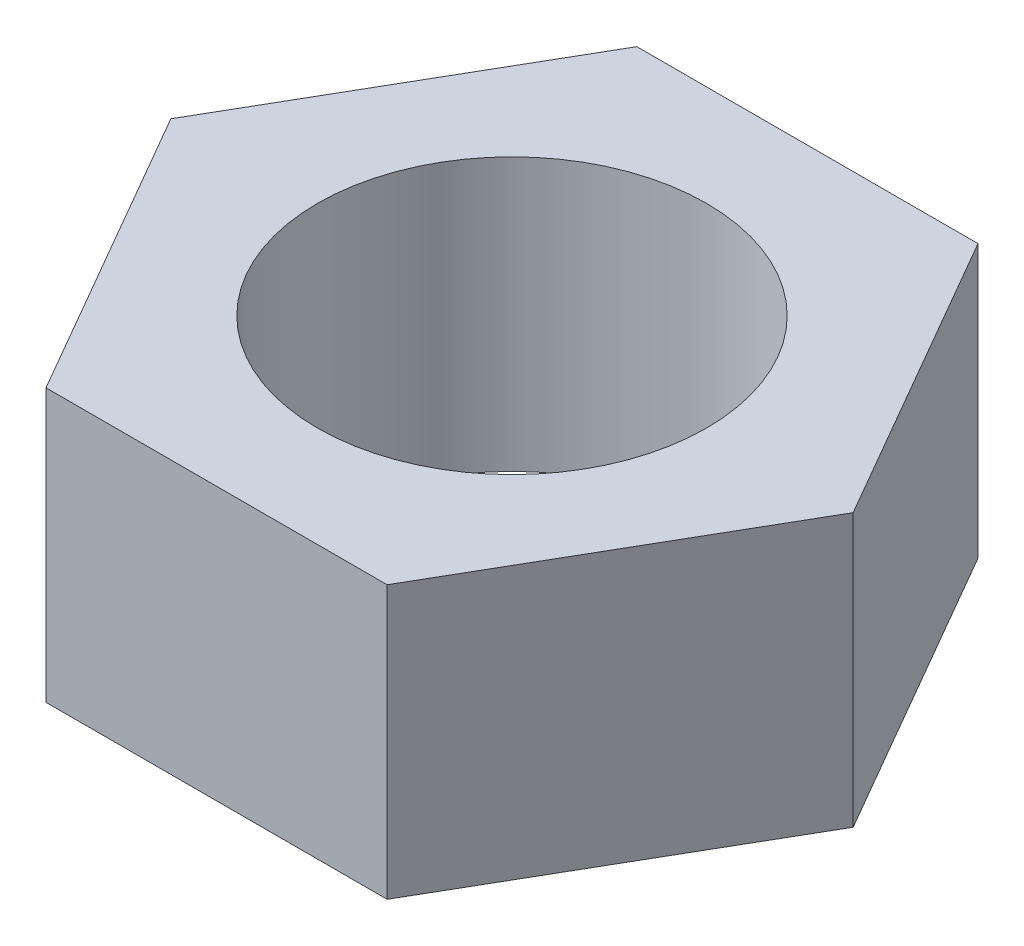
ISO-10303-21;
HEADER;
FILE_DESCRIPTION(('STEP AP214'),'2;1');
FILE_NAME('part.step','',(''),(''),'','','');
FILE_SCHEMA(('AUTOMOTIVE_DESIGN { 1 0 10303 214 1 1 1 1 }'));
ENDSEC;
DATA;
#1=APPLICATION_CONTEXT('core data for automotive mechanical design processes');
#2=APPLICATION_PROTOCOL_DEFINITION('international standard','automotive_design',2000,#1);
#3=PRODUCT_CONTEXT('',#1,'mechanical');
#4=PRODUCT('Part','Part','',(#3));
#5=PRODUCT_RELATED_PRODUCT_CATEGORY('part','',(#4));
#6=PRODUCT_DEFINITION_FORMATION('','',#4);
#7=PRODUCT_DEFINITION_CONTEXT('part definition',#1,'design');
#8=PRODUCT_DEFINITION('design','',#6,#7);
#9=PRODUCT_DEFINITION_SHAPE('','',#8);
#10=(LENGTH_UNIT() NAMED_UNIT(*) SI_UNIT(.MILLI.,.METRE.));
#11=(NAMED_UNIT(*) PLANE_ANGLE_UNIT() SI_UNIT($,.RADIAN.));
#12=(NAMED_UNIT(*) SI_UNIT($,.STERADIAN.) SOLID_ANGLE_UNIT());
#13=UNCERTAINTY_MEASURE_WITH_UNIT(LENGTH_MEASURE(1.E-05),#10,'distance_accuracy_value','');
#14=(GEOMETRIC_REPRESENTATION_CONTEXT(3) GLOBAL_UNCERTAINTY_ASSIGNED_CONTEXT((#13)) GLOBAL_UNIT_ASSIGNED_CONTEXT((#10,
#11,#12)) REPRESENTATION_CONTEXT('',''));
#15=CARTESIAN_POINT('',(0.,0.,0.));
#16=DIRECTION('',(0.,0.,1.));
#17=DIRECTION('',(1.,0.,0.));
#18=AXIS2_PLACEMENT_3D('',#15,#16,#17);
#19=CARTESIAN_POINT('',(0.,7.7,0.));
#20=DIRECTION('',(0.,1.,0.));
#21=DIRECTION('',(0.,0.,1.));
#22=AXIS2_PLACEMENT_3D('',#19,#20,#21);
#23=PLANE('',#22);
#24=DIRECTION('',(1.,0.,0.));
#25=VECTOR('',#24,1.);
#26=CARTESIAN_POINT('',(-4.82087474773337,7.7,8.35));
#27=LINE('',#26,#25);
#28=CARTESIAN_POINT('',(-4.82087474773337,7.7,8.35));
#29=VERTEX_POINT('',#28);
#30=CARTESIAN_POINT('',(4.82087474773337,7.7,8.35));
#31=VERTEX_POINT('',#30);
#32=EDGE_CURVE('E137',#29,#31,#27,.T.);
#33=ORIENTED_EDGE('',*,*,#32,.T.);
#34=DIRECTION('',(0.5,0.,-0.866025403784439));
#35=VECTOR('',#34,1.);
#36=CARTESIAN_POINT('',(4.82087474773337,7.7,8.35));
#37=LINE('',#36,#35);
#38=CARTESIAN_POINT('',(9.64174949546675,7.7,0.));
#39=VERTEX_POINT('',#38);
#40=EDGE_CURVE('E95',#31,#39,#37,.T.);
#41=ORIENTED_EDGE('',*,*,#40,.T.);
#42=DIRECTION('',(-0.5,0.,-0.866025403784439));
#43=VECTOR('',#42,1.);
#44=CARTESIAN_POINT('',(9.64174949546675,7.7,0.));
#45=LINE('',#44,#43);
#46=CARTESIAN_POINT('',(4.82087474773337,7.7,-8.35));
#47=VERTEX_POINT('',#46);
#48=EDGE_CURVE('E108',#39,#47,#45,.T.);
#49=ORIENTED_EDGE('',*,*,#48,.T.);
#50=DIRECTION('',(-1.,0.,0.));
#51=VECTOR('',#50,1.);
#52=CARTESIAN_POINT('',(4.82087474773337,7.7,-8.35));
#53=LINE('',#52,#51);
#54=CARTESIAN_POINT('',(-4.82087474773337,7.7,-8.35));
#55=VERTEX_POINT('',#54);
#56=EDGE_CURVE('E102',#47,#55,#53,.T.);
#57=ORIENTED_EDGE('',*,*,#56,.T.);
#58=DIRECTION('',(-0.5,0.,0.866025403784439));
#59=VECTOR('',#58,1.);
#60=CARTESIAN_POINT('',(-4.82087474773337,7.7,-8.35));
#61=LINE('',#60,#59);
#62=CARTESIAN_POINT('',(-9.64174949546675,7.7,0.));
#63=VERTEX_POINT('',#62);
#64=EDGE_CURVE('E106',#55,#63,#61,.T.);
#65=ORIENTED_EDGE('',*,*,#64,.T.);
#66=DIRECTION('',(0.5,0.,0.866025403784439));
#67=VECTOR('',#66,1.);
#68=CARTESIAN_POINT('',(-9.64174949546675,7.7,0.));
#69=LINE('',#68,#67);
#70=EDGE_CURVE('E58',#63,#29,#69,.T.);
#71=ORIENTED_EDGE('',*,*,#70,.T.);
#72=EDGE_LOOP('',(#33,#41,#49,#57,#65,#71));
#73=FACE_BOUND('',#72,.T.);
#74=CARTESIAN_POINT('',(0.,7.7,0.));
#75=DIRECTION('',(0.,1.,0.));
#76=DIRECTION('',(0.,0.,1.));
#77=AXIS2_PLACEMENT_3D('',#74,#75,#76);
#78=CIRCLE('',#77,5.5);
#79=CARTESIAN_POINT('',(0.,7.7,-5.5));
#80=VERTEX_POINT('',#79);
#81=EDGE_CURVE('E130',#80,#80,#78,.T.);
#82=ORIENTED_EDGE('',*,*,#81,.F.);
#83=EDGE_LOOP('',(#82));
#84=FACE_BOUND('',#83,.T.);
#85=ADVANCED_FACE('F41',(#73,#84),#23,.T.);
#86=CARTESIAN_POINT('',(0.,0.,0.));
#87=DIRECTION('',(0.,1.,0.));
#88=DIRECTION('',(0.,0.,1.));
#89=AXIS2_PLACEMENT_3D('',#86,#87,#88);
#90=PLANE('',#89);
#91=DIRECTION('',(1.,0.,0.));
#92=VECTOR('',#91,1.);
#93=CARTESIAN_POINT('',(-4.82087474773337,0.,8.35));
#94=LINE('',#93,#92);
#95=CARTESIAN_POINT('',(-4.82087474773337,0.,8.35));
#96=VERTEX_POINT('',#95);
#97=CARTESIAN_POINT('',(4.82087474773337,0.,8.35));
#98=VERTEX_POINT('',#97);
#99=EDGE_CURVE('E126',#96,#98,#94,.T.);
#100=ORIENTED_EDGE('',*,*,#99,.F.);
#101=DIRECTION('',(0.5,0.,0.866025403784439));
#102=VECTOR('',#101,1.);
#103=CARTESIAN_POINT('',(-9.64174949546675,0.,0.));
#104=LINE('',#103,#102);
#105=CARTESIAN_POINT('',(-9.64174949546675,0.,0.));
#106=VERTEX_POINT('',#105);
#107=EDGE_CURVE('E87',#106,#96,#104,.T.);
#108=ORIENTED_EDGE('',*,*,#107,.F.);
#109=DIRECTION('',(-0.5,0.,0.866025403784439));
#110=VECTOR('',#109,1.);
#111=CARTESIAN_POINT('',(-4.82087474773337,0.,-8.35));
#112=LINE('',#111,#110);
#113=CARTESIAN_POINT('',(-4.82087474773337,0.,-8.35));
#114=VERTEX_POINT('',#113);
#115=EDGE_CURVE('E81',#114,#106,#112,.T.);
#116=ORIENTED_EDGE('',*,*,#115,.F.);
#117=DIRECTION('',(-1.,0.,0.));
#118=VECTOR('',#117,1.);
#119=CARTESIAN_POINT('',(4.82087474773337,0.,-8.35));
#120=LINE('',#119,#118);
#121=CARTESIAN_POINT('',(4.82087474773337,0.,-8.35));
#122=VERTEX_POINT('',#121);
#123=EDGE_CURVE('E116',#122,#114,#120,.T.);
#124=ORIENTED_EDGE('',*,*,#123,.F.);
#125=DIRECTION('',(-0.5,0.,-0.866025403784439));
#126=VECTOR('',#125,1.);
#127=CARTESIAN_POINT('',(9.64174949546675,0.,0.));
#128=LINE('',#127,#126);
#129=CARTESIAN_POINT('',(9.64174949546675,0.,0.));
#130=VERTEX_POINT('',#129);
#131=EDGE_CURVE('E132',#130,#122,#128,.T.);
#132=ORIENTED_EDGE('',*,*,#131,.F.);
#133=DIRECTION('',(0.5,0.,-0.866025403784439));
#134=VECTOR('',#133,1.);
#135=CARTESIAN_POINT('',(4.82087474773337,0.,8.35));
#136=LINE('',#135,#134);
#137=EDGE_CURVE('E129',#98,#130,#136,.T.);
#138=ORIENTED_EDGE('',*,*,#137,.F.);
#139=EDGE_LOOP('',(#100,#108,#116,#124,#132,#138));
#140=FACE_BOUND('',#139,.T.);
#141=CARTESIAN_POINT('',(0.,0.,0.));
#142=DIRECTION('',(0.,1.,0.));
#143=DIRECTION('',(0.,0.,1.));
#144=AXIS2_PLACEMENT_3D('',#141,#142,#143);
#145=CIRCLE('',#144,5.5);
#146=CARTESIAN_POINT('',(0.,0.,-5.5));
#147=VERTEX_POINT('',#146);
#148=EDGE_CURVE('E230',#147,#147,#145,.T.);
#149=ORIENTED_EDGE('',*,*,#148,.T.);
#150=EDGE_LOOP('',(#149));
#151=FACE_BOUND('',#150,.T.);
#152=ADVANCED_FACE('F146',(#140,#151),#90,.F.);
#153=CARTESIAN_POINT('',(-4.82087474773337,7.7,8.35));
#154=DIRECTION('',(0.,0.,-1.));
#155=DIRECTION('',(-1.,0.,0.));
#156=AXIS2_PLACEMENT_3D('',#153,#154,#155);
#157=PLANE('',#156);
#158=ORIENTED_EDGE('',*,*,#99,.T.);
#159=DIRECTION('',(0.,-1.,0.));
#160=VECTOR('',#159,1.);
#161=CARTESIAN_POINT('',(4.82087474773337,7.7,8.35));
#162=LINE('',#161,#160);
#163=EDGE_CURVE('E11',#31,#98,#162,.T.);
#164=ORIENTED_EDGE('',*,*,#163,.F.);
#165=ORIENTED_EDGE('',*,*,#32,.F.);
#166=DIRECTION('',(0.,-1.,0.));
#167=VECTOR('',#166,1.);
#168=CARTESIAN_POINT('',(-4.82087474773337,7.7,8.35));
#169=LINE('',#168,#167);
#170=EDGE_CURVE('E122',#29,#96,#169,.T.);
#171=ORIENTED_EDGE('',*,*,#170,.T.);
#172=EDGE_LOOP('',(#158,#164,#165,#171));
#173=FACE_BOUND('',#172,.T.);
#174=ADVANCED_FACE('F43',(#173),#157,.F.);
#175=CARTESIAN_POINT('',(4.82087474773337,7.7,8.35));
#176=DIRECTION('',(-0.866025403784439,0.,-0.5));
#177=DIRECTION('',(-0.5,0.,0.866025403784439));
#178=AXIS2_PLACEMENT_3D('',#175,#176,#177);
#179=PLANE('',#178);
#180=ORIENTED_EDGE('',*,*,#137,.T.);
#181=DIRECTION('',(0.,-1.,0.));
#182=VECTOR('',#181,1.);
#183=CARTESIAN_POINT('',(9.64174949546675,7.7,0.));
#184=LINE('',#183,#182);
#185=EDGE_CURVE('E50',#39,#130,#184,.T.);
#186=ORIENTED_EDGE('',*,*,#185,.F.);
#187=ORIENTED_EDGE('',*,*,#40,.F.);
#188=ORIENTED_EDGE('',*,*,#163,.T.);
#189=EDGE_LOOP('',(#180,#186,#187,#188));
#190=FACE_BOUND('',#189,.T.);
#191=ADVANCED_FACE('F171',(#190),#179,.F.);
#192=CARTESIAN_POINT('',(9.64174949546675,7.7,0.));
#193=DIRECTION('',(-0.866025403784438,0.,0.5));
#194=DIRECTION('',(0.5,0.,0.866025403784438));
#195=AXIS2_PLACEMENT_3D('',#192,#193,#194);
#196=PLANE('',#195);
#197=ORIENTED_EDGE('',*,*,#131,.T.);
#198=DIRECTION('',(0.,-1.,0.));
#199=VECTOR('',#198,1.);
#200=CARTESIAN_POINT('',(4.82087474773337,7.7,-8.35));
#201=LINE('',#200,#199);
#202=EDGE_CURVE('E117',#47,#122,#201,.T.);
#203=ORIENTED_EDGE('',*,*,#202,.F.);
#204=ORIENTED_EDGE('',*,*,#48,.F.);
#205=ORIENTED_EDGE('',*,*,#185,.T.);
#206=EDGE_LOOP('',(#197,#203,#204,#205));
#207=FACE_BOUND('',#206,.T.);
#208=ADVANCED_FACE('F143',(#207),#196,.F.);
#209=CARTESIAN_POINT('',(4.82087474773337,7.7,-8.35));
#210=DIRECTION('',(0.,0.,1.));
#211=DIRECTION('',(1.,0.,0.));
#212=AXIS2_PLACEMENT_3D('',#209,#210,#211);
#213=PLANE('',#212);
#214=ORIENTED_EDGE('',*,*,#123,.T.);
#215=DIRECTION('',(0.,-1.,0.));
#216=VECTOR('',#215,1.);
#217=CARTESIAN_POINT('',(-4.82087474773337,7.7,-8.35));
#218=LINE('',#217,#216);
#219=EDGE_CURVE('E113',#55,#114,#218,.T.);
#220=ORIENTED_EDGE('',*,*,#219,.F.);
#221=ORIENTED_EDGE('',*,*,#56,.F.);
#222=ORIENTED_EDGE('',*,*,#202,.T.);
#223=EDGE_LOOP('',(#214,#220,#221,#222));
#224=FACE_BOUND('',#223,.T.);
#225=ADVANCED_FACE('F114',(#224),#213,.F.);
#226=CARTESIAN_POINT('',(-4.82087474773337,7.7,-8.35));
#227=DIRECTION('',(0.866025403784439,0.,0.5));
#228=DIRECTION('',(0.5,0.,-0.866025403784439));
#229=AXIS2_PLACEMENT_3D('',#226,#227,#228);
#230=PLANE('',#229);
#231=ORIENTED_EDGE('',*,*,#115,.T.);
#232=DIRECTION('',(0.,-1.,0.));
#233=VECTOR('',#232,1.);
#234=CARTESIAN_POINT('',(-9.64174949546675,7.7,0.));
#235=LINE('',#234,#233);
#236=EDGE_CURVE('E118',#63,#106,#235,.T.);
#237=ORIENTED_EDGE('',*,*,#236,.F.);
#238=ORIENTED_EDGE('',*,*,#64,.F.);
#239=ORIENTED_EDGE('',*,*,#219,.T.);
#240=EDGE_LOOP('',(#231,#237,#238,#239));
#241=FACE_BOUND('',#240,.T.);
#242=ADVANCED_FACE('F120',(#241),#230,.F.);
#243=CARTESIAN_POINT('',(-9.64174949546675,7.7,0.));
#244=DIRECTION('',(0.866025403784439,0.,-0.5));
#245=DIRECTION('',(-0.5,0.,-0.866025403784439));
#246=AXIS2_PLACEMENT_3D('',#243,#244,#245);
#247=PLANE('',#246);
#248=ORIENTED_EDGE('',*,*,#107,.T.);
#249=ORIENTED_EDGE('',*,*,#170,.F.);
#250=ORIENTED_EDGE('',*,*,#70,.F.);
#251=ORIENTED_EDGE('',*,*,#236,.T.);
#252=EDGE_LOOP('',(#248,#249,#250,#251));
#253=FACE_BOUND('',#252,.T.);
#254=ADVANCED_FACE('F151',(#253),#247,.F.);
#255=CARTESIAN_POINT('',(0.,7.7,0.));
#256=DIRECTION('',(0.,-1.,0.));
#257=DIRECTION('',(0.,0.,-1.));
#258=AXIS2_PLACEMENT_3D('',#255,#256,#257);
#259=CYLINDRICAL_SURFACE('',#258,5.5);
#260=CARTESIAN_POINT('',(0.,7.7,-5.5));
#261=CARTESIAN_POINT('',(0.,7.61979166666667,-5.5));
#262=CARTESIAN_POINT('',(0.,7.53958333333333,-5.5));
#263=CARTESIAN_POINT('',(0.,7.37916666666667,-5.5));
#264=CARTESIAN_POINT('',(0.,7.29895833333333,-5.5));
#265=CARTESIAN_POINT('',(0.,7.13854166666667,-5.5));
#266=CARTESIAN_POINT('',(0.,7.05833333333333,-5.5));
#267=CARTESIAN_POINT('',(0.,6.89791666666667,-5.5));
#268=CARTESIAN_POINT('',(0.,6.81770833333333,-5.5));
#269=CARTESIAN_POINT('',(0.,6.65729166666667,-5.5));
#270=CARTESIAN_POINT('',(0.,6.57708333333333,-5.5));
#271=CARTESIAN_POINT('',(0.,6.41666666666667,-5.5));
#272=CARTESIAN_POINT('',(0.,6.33645833333333,-5.5));
#273=CARTESIAN_POINT('',(0.,6.17604166666667,-5.5));
#274=CARTESIAN_POINT('',(0.,6.09583333333333,-5.5));
#275=CARTESIAN_POINT('',(0.,5.93541666666667,-5.5));
#276=CARTESIAN_POINT('',(0.,5.85520833333333,-5.5));
#277=CARTESIAN_POINT('',(0.,5.69479166666667,-5.5));
#278=CARTESIAN_POINT('',(0.,5.61458333333333,-5.5));
#279=CARTESIAN_POINT('',(0.,5.45416666666667,-5.5));
#280=CARTESIAN_POINT('',(0.,5.37395833333333,-5.5));
#281=CARTESIAN_POINT('',(0.,5.21354166666667,-5.5));
#282=CARTESIAN_POINT('',(0.,5.13333333333333,-5.5));
#283=CARTESIAN_POINT('',(0.,4.97291666666667,-5.5));
#284=CARTESIAN_POINT('',(0.,4.89270833333333,-5.5));
#285=CARTESIAN_POINT('',(0.,4.73229166666667,-5.5));
#286=CARTESIAN_POINT('',(0.,4.65208333333333,-5.5));
#287=CARTESIAN_POINT('',(0.,4.49166666666667,-5.5));
#288=CARTESIAN_POINT('',(0.,4.41145833333333,-5.5));
#289=CARTESIAN_POINT('',(0.,4.25104166666667,-5.5));
#290=CARTESIAN_POINT('',(0.,4.17083333333333,-5.5));
#291=CARTESIAN_POINT('',(0.,4.01041666666667,-5.5));
#292=CARTESIAN_POINT('',(0.,3.93020833333333,-5.5));
#293=CARTESIAN_POINT('',(0.,3.76979166666667,-5.5));
#294=CARTESIAN_POINT('',(0.,3.68958333333333,-5.5));
#295=CARTESIAN_POINT('',(0.,3.52916666666667,-5.5));
#296=CARTESIAN_POINT('',(0.,3.44895833333333,-5.5));
#297=CARTESIAN_POINT('',(0.,3.28854166666667,-5.5));
#298=CARTESIAN_POINT('',(0.,3.20833333333333,-5.5));
#299=CARTESIAN_POINT('',(0.,3.04791666666667,-5.5));
#300=CARTESIAN_POINT('',(0.,2.96770833333333,-5.5));
#301=CARTESIAN_POINT('',(0.,2.80729166666667,-5.5));
#302=CARTESIAN_POINT('',(0.,2.72708333333333,-5.5));
#303=CARTESIAN_POINT('',(0.,2.56666666666667,-5.5));
#304=CARTESIAN_POINT('',(0.,2.48645833333333,-5.5));
#305=CARTESIAN_POINT('',(0.,2.32604166666667,-5.5));
#306=CARTESIAN_POINT('',(0.,2.24583333333333,-5.5));
#307=CARTESIAN_POINT('',(0.,2.08541666666667,-5.5));
#308=CARTESIAN_POINT('',(0.,2.00520833333333,-5.5));
#309=CARTESIAN_POINT('',(0.,1.84479166666667,-5.5));
#310=CARTESIAN_POINT('',(0.,1.76458333333333,-5.5));
#311=CARTESIAN_POINT('',(0.,1.60416666666667,-5.5));
#312=CARTESIAN_POINT('',(0.,1.52395833333333,-5.5));
#313=CARTESIAN_POINT('',(0.,1.36354166666667,-5.5));
#314=CARTESIAN_POINT('',(0.,1.28333333333333,-5.5));
#315=CARTESIAN_POINT('',(0.,1.12291666666667,-5.5));
#316=CARTESIAN_POINT('',(0.,1.04270833333333,-5.5));
#317=CARTESIAN_POINT('',(0.,0.882291666666666,-5.5));
#318=CARTESIAN_POINT('',(0.,0.802083333333333,-5.5));
#319=CARTESIAN_POINT('',(0.,0.641666666666666,-5.5));
#320=CARTESIAN_POINT('',(0.,0.561458333333332,-5.5));
#321=CARTESIAN_POINT('',(0.,0.401041666666666,-5.5));
#322=CARTESIAN_POINT('',(0.,0.320833333333333,-5.5));
#323=CARTESIAN_POINT('',(0.,0.160416666666666,-5.5));
#324=CARTESIAN_POINT('',(0.,0.0802083333333325,-5.5));
#325=CARTESIAN_POINT('',(0.,0.,-5.5));
#326=B_SPLINE_CURVE_WITH_KNOTS('',3,(#260,#261,#262,#263,#264,#265,#266,#267,#268,#269,#270,
#271,#272,#273,#274,#275,#276,#277,#278,#279,#280,#281,#282,#283,#284,#285,#286,#287,#288,#289,
#290,#291,#292,#293,#294,#295,#296,#297,#298,#299,#300,#301,#302,#303,#304,#305,#306,#307,#308,
#309,#310,#311,#312,#313,#314,#315,#316,#317,#318,#319,#320,#321,#322,#323,#324,#325),
.UNSPECIFIED.,.F.,.F.,(4,2,2,2,2,2,2,2,2,2,2,2,2,2,2,2,2,2,2,2,2,2,2,2,2,2,2,2,2,2,2,2,4),(0.,
0.240625,0.48125,0.721874999999999,0.9625,1.203125,1.44375,1.684375,1.925,2.165625,2.40625,
2.646875,2.8875,3.128125,3.36875,3.609375,3.85,4.090625,4.33125,4.571875,4.8125,5.053125,
5.29375,5.534375,5.775,6.015625,6.25625,6.496875,6.7375,6.978125,7.21875,7.459375,7.7),.UNSPECIFIED.);
#327=EDGE_CURVE('BSEAM153',#80,#147,#326,.T.);
#328=ORIENTED_EDGE('',*,*,#81,.T.);
#329=ORIENTED_EDGE('',*,*,#148,.F.);
#330=ORIENTED_EDGE('',*,*,#327,.T.);
#331=ORIENTED_EDGE('',*,*,#327,.F.);
#332=EDGE_LOOP('',(#328,#330,#329,#331));
#333=FACE_BOUND('',#332,.T.);
#334=ADVANCED_FACE('F153',(#333),#259,.F.);
#335=CLOSED_SHELL('',(#85,#152,#174,#191,#208,#225,#242,#254,#334));
#336=MANIFOLD_SOLID_BREP('B2',#335);
#337=ADVANCED_BREP_SHAPE_REPRESENTATION('',(#18,#336),#14);
#338=SHAPE_DEFINITION_REPRESENTATION(#9,#337);
ENDSEC;
END-ISO-10303-21;
